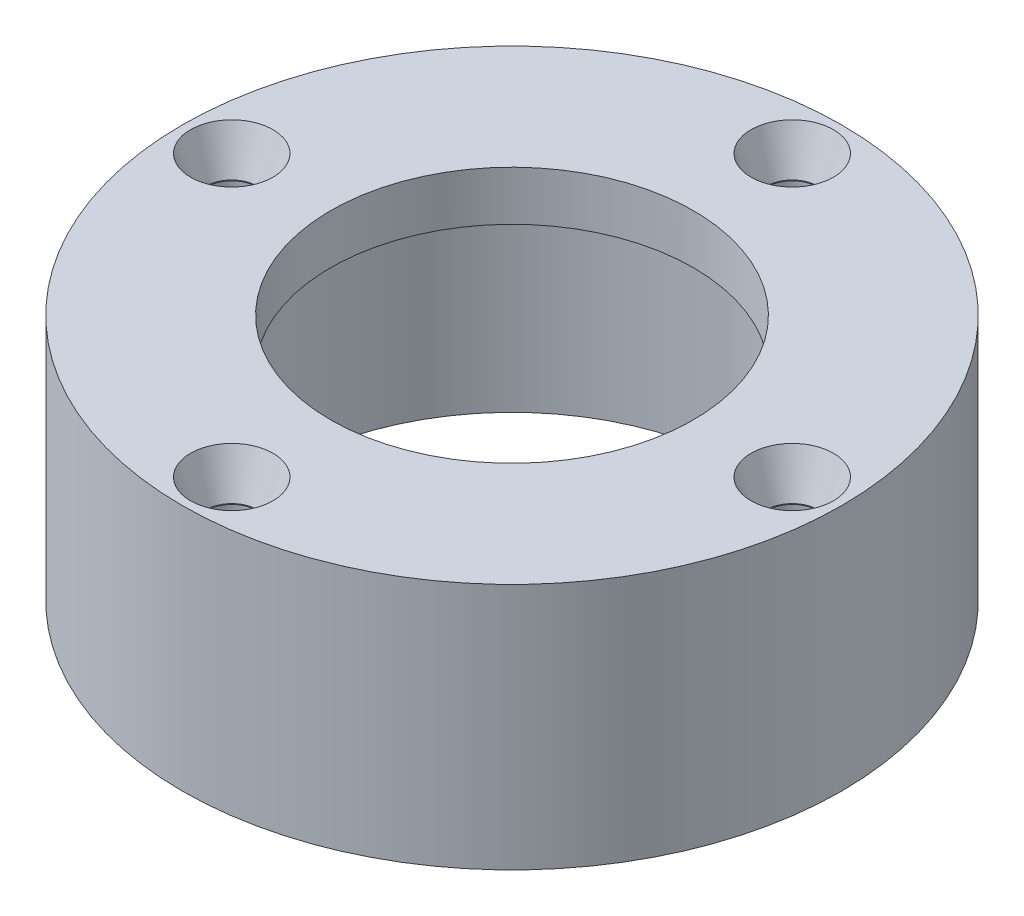
ISO-10303-21;
HEADER;
FILE_DESCRIPTION(('STEP AP214'),'2;1');
FILE_NAME('part.step','',(''),(''),'','','');
FILE_SCHEMA(('AUTOMOTIVE_DESIGN { 1 0 10303 214 1 1 1 1 }'));
ENDSEC;
DATA;
#1=APPLICATION_CONTEXT('core data for automotive mechanical design processes');
#2=APPLICATION_PROTOCOL_DEFINITION('international standard','automotive_design',2000,#1);
#3=PRODUCT_CONTEXT('',#1,'mechanical');
#4=PRODUCT('Part','Part','',(#3));
#5=PRODUCT_RELATED_PRODUCT_CATEGORY('part','',(#4));
#6=PRODUCT_DEFINITION_FORMATION('','',#4);
#7=PRODUCT_DEFINITION_CONTEXT('part definition',#1,'design');
#8=PRODUCT_DEFINITION('design','',#6,#7);
#9=PRODUCT_DEFINITION_SHAPE('','',#8);
#10=(LENGTH_UNIT() NAMED_UNIT(*) SI_UNIT(.MILLI.,.METRE.));
#11=(NAMED_UNIT(*) PLANE_ANGLE_UNIT() SI_UNIT($,.RADIAN.));
#12=(NAMED_UNIT(*) SI_UNIT($,.STERADIAN.) SOLID_ANGLE_UNIT());
#13=UNCERTAINTY_MEASURE_WITH_UNIT(LENGTH_MEASURE(1.E-05),#10,'distance_accuracy_value','');
#14=(GEOMETRIC_REPRESENTATION_CONTEXT(3) GLOBAL_UNCERTAINTY_ASSIGNED_CONTEXT((#13)) GLOBAL_UNIT_ASSIGNED_CONTEXT((#10,
#11,#12)) REPRESENTATION_CONTEXT('',''));
#15=CARTESIAN_POINT('',(0.,0.,0.));
#16=DIRECTION('',(0.,0.,1.));
#17=DIRECTION('',(1.,0.,0.));
#18=AXIS2_PLACEMENT_3D('',#15,#16,#17);
#19=CARTESIAN_POINT('',(-17.,20.,1.78065548281E-13));
#20=DIRECTION('',(0.,-1.,0.));
#21=DIRECTION('',(0.,0.,-1.));
#22=AXIS2_PLACEMENT_3D('',#19,#20,#21);
#23=CYLINDRICAL_SURFACE('',#22,1.5);
#24=CARTESIAN_POINT('',(-17.,0.,1.78065548281E-13));
#25=DIRECTION('',(0.,-1.,0.));
#26=DIRECTION('',(0.,0.,-1.));
#27=AXIS2_PLACEMENT_3D('',#24,#25,#26);
#28=CIRCLE('',#27,1.5);
#29=CARTESIAN_POINT('',(-17.,0.,-1.49999999999982));
#30=VERTEX_POINT('',#29);
#31=EDGE_CURVE('E52',#30,#30,#28,.T.);
#32=ORIENTED_EDGE('',*,*,#31,.T.);
#33=EDGE_LOOP('',(#32));
#34=FACE_BOUND('',#33,.T.);
#35=CARTESIAN_POINT('',(-17.,12.5,1.78065548281E-13));
#36=DIRECTION('',(0.,1.,0.));
#37=DIRECTION('',(0.,0.,1.));
#38=AXIS2_PLACEMENT_3D('',#35,#36,#37);
#39=CIRCLE('',#38,1.5);
#40=CARTESIAN_POINT('',(-17.,12.5,1.50000000000018));
#41=VERTEX_POINT('',#40);
#42=EDGE_CURVE('E63',#41,#41,#39,.F.);
#43=ORIENTED_EDGE('',*,*,#42,.F.);
#44=EDGE_LOOP('',(#43));
#45=FACE_BOUND('',#44,.T.);
#46=ADVANCED_FACE('F31',(#34,#45),#23,.F.);
#47=CARTESIAN_POINT('',(0.,20.,17.));
#48=DIRECTION('',(0.,-1.,0.));
#49=DIRECTION('',(0.,0.,-1.));
#50=AXIS2_PLACEMENT_3D('',#47,#48,#49);
#51=CYLINDRICAL_SURFACE('',#50,1.5);
#52=CARTESIAN_POINT('',(0.,0.,17.));
#53=DIRECTION('',(0.,-1.,0.));
#54=DIRECTION('',(0.,0.,-1.));
#55=AXIS2_PLACEMENT_3D('',#52,#53,#54);
#56=CIRCLE('',#55,1.5);
#57=CARTESIAN_POINT('',(0.,0.,15.5));
#58=VERTEX_POINT('',#57);
#59=EDGE_CURVE('E44',#58,#58,#56,.T.);
#60=ORIENTED_EDGE('',*,*,#59,.T.);
#61=EDGE_LOOP('',(#60));
#62=FACE_BOUND('',#61,.T.);
#63=CARTESIAN_POINT('',(0.,12.5,17.));
#64=DIRECTION('',(0.,1.,0.));
#65=DIRECTION('',(0.,0.,1.));
#66=AXIS2_PLACEMENT_3D('',#63,#64,#65);
#67=CIRCLE('',#66,1.5);
#68=CARTESIAN_POINT('',(0.,12.5,18.5));
#69=VERTEX_POINT('',#68);
#70=EDGE_CURVE('E59',#69,#69,#67,.F.);
#71=ORIENTED_EDGE('',*,*,#70,.F.);
#72=EDGE_LOOP('',(#71));
#73=FACE_BOUND('',#72,.T.);
#74=ADVANCED_FACE('F102',(#62,#73),#51,.F.);
#75=CARTESIAN_POINT('',(17.,20.,0.));
#76=DIRECTION('',(0.,-1.,0.));
#77=DIRECTION('',(0.,0.,-1.));
#78=AXIS2_PLACEMENT_3D('',#75,#76,#77);
#79=CYLINDRICAL_SURFACE('',#78,1.5);
#80=CARTESIAN_POINT('',(17.,0.,0.));
#81=DIRECTION('',(0.,-1.,0.));
#82=DIRECTION('',(0.,0.,-1.));
#83=AXIS2_PLACEMENT_3D('',#80,#81,#82);
#84=CIRCLE('',#83,1.5);
#85=CARTESIAN_POINT('',(17.,0.,-1.50000000000006));
#86=VERTEX_POINT('',#85);
#87=EDGE_CURVE('E95',#86,#86,#84,.T.);
#88=ORIENTED_EDGE('',*,*,#87,.T.);
#89=EDGE_LOOP('',(#88));
#90=FACE_BOUND('',#89,.T.);
#91=CARTESIAN_POINT('',(17.,12.5,0.));
#92=DIRECTION('',(0.,1.,0.));
#93=DIRECTION('',(0.,0.,1.));
#94=AXIS2_PLACEMENT_3D('',#91,#92,#93);
#95=CIRCLE('',#94,1.5);
#96=CARTESIAN_POINT('',(17.,12.5,1.49999999999994));
#97=VERTEX_POINT('',#96);
#98=EDGE_CURVE('E54',#97,#97,#95,.F.);
#99=ORIENTED_EDGE('',*,*,#98,.F.);
#100=EDGE_LOOP('',(#99));
#101=FACE_BOUND('',#100,.T.);
#102=ADVANCED_FACE('F123',(#90,#101),#79,.F.);
#103=CARTESIAN_POINT('',(-1.18710365520667E-13,20.,-17.));
#104=DIRECTION('',(0.,-1.,0.));
#105=DIRECTION('',(0.,0.,-1.));
#106=AXIS2_PLACEMENT_3D('',#103,#104,#105);
#107=CYLINDRICAL_SURFACE('',#106,1.5);
#108=CARTESIAN_POINT('',(-1.18710365520667E-13,0.,-17.));
#109=DIRECTION('',(0.,-1.,0.));
#110=DIRECTION('',(0.,0.,-1.));
#111=AXIS2_PLACEMENT_3D('',#108,#109,#110);
#112=CIRCLE('',#111,1.5);
#113=CARTESIAN_POINT('',(-1.18710365520667E-13,0.,-18.5));
#114=VERTEX_POINT('',#113);
#115=EDGE_CURVE('E93',#114,#114,#112,.T.);
#116=ORIENTED_EDGE('',*,*,#115,.T.);
#117=EDGE_LOOP('',(#116));
#118=FACE_BOUND('',#117,.T.);
#119=CARTESIAN_POINT('',(-1.18710365520667E-13,12.5,-17.));
#120=DIRECTION('',(0.,1.,0.));
#121=DIRECTION('',(0.,0.,1.));
#122=AXIS2_PLACEMENT_3D('',#119,#120,#121);
#123=CIRCLE('',#122,1.5);
#124=CARTESIAN_POINT('',(-1.18710365520667E-13,12.5,-15.5));
#125=VERTEX_POINT('',#124);
#126=EDGE_CURVE('E49',#125,#125,#123,.F.);
#127=ORIENTED_EDGE('',*,*,#126,.F.);
#128=EDGE_LOOP('',(#127));
#129=FACE_BOUND('',#128,.T.);
#130=ADVANCED_FACE('F114',(#118,#129),#107,.F.);
#131=CARTESIAN_POINT('',(0.,15.,0.));
#132=DIRECTION('',(0.,-1.,0.));
#133=DIRECTION('',(0.,0.,-1.));
#134=AXIS2_PLACEMENT_3D('',#131,#132,#133);
#135=CYLINDRICAL_SURFACE('',#134,20.);
#136=CARTESIAN_POINT('',(0.,15.,0.));
#137=DIRECTION('',(0.,1.,0.));
#138=DIRECTION('',(0.,0.,1.));
#139=AXIS2_PLACEMENT_3D('',#136,#137,#138);
#140=CIRCLE('',#139,20.);
#141=CARTESIAN_POINT('',(0.,15.,20.));
#142=VERTEX_POINT('',#141);
#143=EDGE_CURVE('E10',#142,#142,#140,.T.);
#144=ORIENTED_EDGE('',*,*,#143,.F.);
#145=EDGE_LOOP('',(#144));
#146=FACE_BOUND('',#145,.T.);
#147=CARTESIAN_POINT('',(0.,0.,0.));
#148=DIRECTION('',(0.,1.,0.));
#149=DIRECTION('',(0.,0.,1.));
#150=AXIS2_PLACEMENT_3D('',#147,#148,#149);
#151=CIRCLE('',#150,20.);
#152=CARTESIAN_POINT('',(0.,0.,20.));
#153=VERTEX_POINT('',#152);
#154=EDGE_CURVE('E39',#153,#153,#151,.T.);
#155=ORIENTED_EDGE('',*,*,#154,.T.);
#156=EDGE_LOOP('',(#155));
#157=FACE_BOUND('',#156,.T.);
#158=ADVANCED_FACE('F33',(#146,#157),#135,.T.);
#159=CARTESIAN_POINT('',(0.,15.,0.));
#160=DIRECTION('',(0.,1.,0.));
#161=DIRECTION('',(0.,0.,1.));
#162=AXIS2_PLACEMENT_3D('',#159,#160,#161);
#163=PLANE('',#162);
#164=CARTESIAN_POINT('',(0.,15.,0.));
#165=DIRECTION('',(0.,1.,0.));
#166=DIRECTION('',(0.,0.,1.));
#167=AXIS2_PLACEMENT_3D('',#164,#165,#166);
#168=CIRCLE('',#167,11.);
#169=CARTESIAN_POINT('',(0.,15.,11.));
#170=VERTEX_POINT('',#169);
#171=EDGE_CURVE('E267',#170,#170,#168,.T.);
#172=ORIENTED_EDGE('',*,*,#171,.F.);
#173=EDGE_LOOP('',(#172));
#174=FACE_BOUND('',#173,.T.);
#175=CARTESIAN_POINT('',(-16.9999999999995,15.,6.03961325396085E-13));
#176=DIRECTION('',(0.,1.,0.));
#177=DIRECTION('',(0.,0.,1.));
#178=AXIS2_PLACEMENT_3D('',#175,#176,#177);
#179=CIRCLE('',#178,2.50000000000078);
#180=CARTESIAN_POINT('',(-16.9999999999995,15.,2.50000000000138));
#181=VERTEX_POINT('',#180);
#182=EDGE_CURVE('E72',#181,#181,#179,.T.);
#183=ORIENTED_EDGE('',*,*,#182,.F.);
#184=EDGE_LOOP('',(#183));
#185=FACE_BOUND('',#184,.T.);
#186=CARTESIAN_POINT('',(1.0850484861544E-12,15.,17.));
#187=DIRECTION('',(0.,1.,0.));
#188=DIRECTION('',(0.,0.,1.));
#189=AXIS2_PLACEMENT_3D('',#186,#187,#188);
#190=CIRCLE('',#189,2.50000000000104);
#191=CARTESIAN_POINT('',(1.0850484861544E-12,15.,19.500000000001));
#192=VERTEX_POINT('',#191);
#193=EDGE_CURVE('E65',#192,#192,#190,.T.);
#194=ORIENTED_EDGE('',*,*,#193,.F.);
#195=EDGE_LOOP('',(#194));
#196=FACE_BOUND('',#195,.T.);
#197=CARTESIAN_POINT('',(17.0000000000005,15.,-6.01879425837535E-13));
#198=DIRECTION('',(0.,1.,0.));
#199=DIRECTION('',(0.,0.,1.));
#200=AXIS2_PLACEMENT_3D('',#197,#198,#199);
#201=CIRCLE('',#200,2.50000000000038);
#202=CARTESIAN_POINT('',(17.0000000000005,15.,2.49999999999978));
#203=VERTEX_POINT('',#202);
#204=EDGE_CURVE('E61',#203,#203,#201,.T.);
#205=ORIENTED_EDGE('',*,*,#204,.F.);
#206=EDGE_LOOP('',(#205));
#207=FACE_BOUND('',#206,.T.);
#208=CARTESIAN_POINT('',(-1.18710365520667E-13,15.,-17.));
#209=DIRECTION('',(0.,1.,0.));
#210=DIRECTION('',(0.,0.,1.));
#211=AXIS2_PLACEMENT_3D('',#208,#209,#210);
#212=CIRCLE('',#211,2.5);
#213=CARTESIAN_POINT('',(-1.18710365520667E-13,15.,-14.5));
#214=VERTEX_POINT('',#213);
#215=EDGE_CURVE('E57',#214,#214,#212,.T.);
#216=ORIENTED_EDGE('',*,*,#215,.F.);
#217=EDGE_LOOP('',(#216));
#218=FACE_BOUND('',#217,.T.);
#219=ORIENTED_EDGE('',*,*,#143,.T.);
#220=EDGE_LOOP('',(#219));
#221=FACE_BOUND('',#220,.T.);
#222=ADVANCED_FACE('F109',(#174,#185,#196,#207,#218,#221),#163,.T.);
#223=CARTESIAN_POINT('',(0.,0.,0.));
#224=DIRECTION('',(0.,1.,0.));
#225=DIRECTION('',(0.,0.,1.));
#226=AXIS2_PLACEMENT_3D('',#223,#224,#225);
#227=PLANE('',#226);
#228=CARTESIAN_POINT('',(0.,0.,0.));
#229=DIRECTION('',(0.,-1.,0.));
#230=DIRECTION('',(0.,0.,-1.));
#231=AXIS2_PLACEMENT_3D('',#228,#229,#230);
#232=CIRCLE('',#231,14.);
#233=CARTESIAN_POINT('',(0.,0.,-14.));
#234=VERTEX_POINT('',#233);
#235=EDGE_CURVE('E269',#234,#234,#232,.T.);
#236=ORIENTED_EDGE('',*,*,#235,.F.);
#237=EDGE_LOOP('',(#236));
#238=FACE_BOUND('',#237,.T.);
#239=ORIENTED_EDGE('',*,*,#31,.F.);
#240=EDGE_LOOP('',(#239));
#241=FACE_BOUND('',#240,.T.);
#242=ORIENTED_EDGE('',*,*,#115,.F.);
#243=EDGE_LOOP('',(#242));
#244=FACE_BOUND('',#243,.T.);
#245=ORIENTED_EDGE('',*,*,#87,.F.);
#246=EDGE_LOOP('',(#245));
#247=FACE_BOUND('',#246,.T.);
#248=ORIENTED_EDGE('',*,*,#59,.F.);
#249=EDGE_LOOP('',(#248));
#250=FACE_BOUND('',#249,.T.);
#251=ORIENTED_EDGE('',*,*,#154,.F.);
#252=EDGE_LOOP('',(#251));
#253=FACE_BOUND('',#252,.T.);
#254=ADVANCED_FACE('F105',(#238,#241,#244,#247,#250,#253),#227,.F.);
#255=CARTESIAN_POINT('',(-1.18710365520667E-13,12.5,-17.));
#256=DIRECTION('',(0.,1.,0.));
#257=DIRECTION('',(0.,0.,1.));
#258=AXIS2_PLACEMENT_3D('',#255,#256,#257);
#259=PLANE('',#258);
#260=CARTESIAN_POINT('',(-1.18710365520667E-13,12.5,-17.));
#261=DIRECTION('',(0.,1.,0.));
#262=DIRECTION('',(0.,0.,1.));
#263=AXIS2_PLACEMENT_3D('',#260,#261,#262);
#264=CIRCLE('',#263,1.56528830128799);
#265=CARTESIAN_POINT('',(-1.18710365520667E-13,12.5,-15.434711698712));
#266=VERTEX_POINT('',#265);
#267=EDGE_CURVE('E53',#266,#266,#264,.T.);
#268=ORIENTED_EDGE('',*,*,#267,.T.);
#269=EDGE_LOOP('',(#268));
#270=FACE_BOUND('',#269,.T.);
#271=ORIENTED_EDGE('',*,*,#126,.T.);
#272=EDGE_LOOP('',(#271));
#273=FACE_BOUND('',#272,.T.);
#274=ADVANCED_FACE('F108',(#270,#273),#259,.T.);
#275=CARTESIAN_POINT('',(-1.18710365520667E-13,15.,-17.));
#276=DIRECTION('',(0.,1.,0.));
#277=DIRECTION('',(0.,0.,1.));
#278=AXIS2_PLACEMENT_3D('',#275,#276,#277);
#279=CONICAL_SURFACE('',#278,2.5,0.357792496658838);
#280=ORIENTED_EDGE('',*,*,#267,.F.);
#281=EDGE_LOOP('',(#280));
#282=FACE_BOUND('',#281,.T.);
#283=ORIENTED_EDGE('',*,*,#215,.T.);
#284=EDGE_LOOP('',(#283));
#285=FACE_BOUND('',#284,.T.);
#286=ADVANCED_FACE('F135',(#282,#285),#279,.F.);
#287=CARTESIAN_POINT('',(17.0000000000005,12.5,-6.01879425837535E-13));
#288=DIRECTION('',(0.,1.,0.));
#289=DIRECTION('',(0.,0.,1.));
#290=AXIS2_PLACEMENT_3D('',#287,#288,#289);
#291=PLANE('',#290);
#292=CARTESIAN_POINT('',(17.0000000000005,12.5,-6.01879425837535E-13));
#293=DIRECTION('',(0.,1.,0.));
#294=DIRECTION('',(0.,0.,1.));
#295=AXIS2_PLACEMENT_3D('',#292,#293,#294);
#296=CIRCLE('',#295,1.56528830128836);
#297=CARTESIAN_POINT('',(17.0000000000005,12.5,1.56528830128776));
#298=VERTEX_POINT('',#297);
#299=EDGE_CURVE('E58',#298,#298,#296,.T.);
#300=ORIENTED_EDGE('',*,*,#299,.T.);
#301=EDGE_LOOP('',(#300));
#302=FACE_BOUND('',#301,.T.);
#303=ORIENTED_EDGE('',*,*,#98,.T.);
#304=EDGE_LOOP('',(#303));
#305=FACE_BOUND('',#304,.T.);
#306=ADVANCED_FACE('F144',(#302,#305),#291,.T.);
#307=CARTESIAN_POINT('',(17.0000000000005,15.,-6.01879425837535E-13));
#308=DIRECTION('',(0.,1.,0.));
#309=DIRECTION('',(0.,0.,1.));
#310=AXIS2_PLACEMENT_3D('',#307,#308,#309);
#311=CONICAL_SURFACE('',#310,2.50000000000038,0.357792496658838);
#312=ORIENTED_EDGE('',*,*,#299,.F.);
#313=EDGE_LOOP('',(#312));
#314=FACE_BOUND('',#313,.T.);
#315=ORIENTED_EDGE('',*,*,#204,.T.);
#316=EDGE_LOOP('',(#315));
#317=FACE_BOUND('',#316,.T.);
#318=ADVANCED_FACE('F146',(#314,#317),#311,.F.);
#319=CARTESIAN_POINT('',(1.0850484861544E-12,12.5,17.));
#320=DIRECTION('',(0.,1.,0.));
#321=DIRECTION('',(0.,0.,1.));
#322=AXIS2_PLACEMENT_3D('',#319,#320,#321);
#323=PLANE('',#322);
#324=CARTESIAN_POINT('',(1.0850484861544E-12,12.5,17.));
#325=DIRECTION('',(0.,1.,0.));
#326=DIRECTION('',(0.,0.,1.));
#327=AXIS2_PLACEMENT_3D('',#324,#325,#326);
#328=CIRCLE('',#327,1.56528830128902);
#329=CARTESIAN_POINT('',(1.0850484861544E-12,12.5,18.565288301289));
#330=VERTEX_POINT('',#329);
#331=EDGE_CURVE('E62',#330,#330,#328,.T.);
#332=ORIENTED_EDGE('',*,*,#331,.T.);
#333=EDGE_LOOP('',(#332));
#334=FACE_BOUND('',#333,.T.);
#335=ORIENTED_EDGE('',*,*,#70,.T.);
#336=EDGE_LOOP('',(#335));
#337=FACE_BOUND('',#336,.T.);
#338=ADVANCED_FACE('F153',(#334,#337),#323,.T.);
#339=CARTESIAN_POINT('',(1.0850484861544E-12,15.,17.));
#340=DIRECTION('',(0.,1.,0.));
#341=DIRECTION('',(0.,0.,1.));
#342=AXIS2_PLACEMENT_3D('',#339,#340,#341);
#343=CONICAL_SURFACE('',#342,2.50000000000104,0.357792496658838);
#344=ORIENTED_EDGE('',*,*,#331,.F.);
#345=EDGE_LOOP('',(#344));
#346=FACE_BOUND('',#345,.T.);
#347=ORIENTED_EDGE('',*,*,#193,.T.);
#348=EDGE_LOOP('',(#347));
#349=FACE_BOUND('',#348,.T.);
#350=ADVANCED_FACE('F158',(#346,#349),#343,.F.);
#351=CARTESIAN_POINT('',(-16.9999999999995,12.5,6.03961325396085E-13));
#352=DIRECTION('',(0.,1.,0.));
#353=DIRECTION('',(0.,0.,1.));
#354=AXIS2_PLACEMENT_3D('',#351,#352,#353);
#355=PLANE('',#354);
#356=CARTESIAN_POINT('',(-16.9999999999995,12.5,6.03961325396085E-13));
#357=DIRECTION('',(0.,1.,0.));
#358=DIRECTION('',(0.,0.,1.));
#359=AXIS2_PLACEMENT_3D('',#356,#357,#358);
#360=CIRCLE('',#359,1.56528830128876);
#361=CARTESIAN_POINT('',(-16.9999999999995,12.5,1.56528830128937));
#362=VERTEX_POINT('',#361);
#363=EDGE_CURVE('E66',#362,#362,#360,.T.);
#364=ORIENTED_EDGE('',*,*,#363,.T.);
#365=EDGE_LOOP('',(#364));
#366=FACE_BOUND('',#365,.T.);
#367=ORIENTED_EDGE('',*,*,#42,.T.);
#368=EDGE_LOOP('',(#367));
#369=FACE_BOUND('',#368,.T.);
#370=ADVANCED_FACE('F206',(#366,#369),#355,.T.);
#371=CARTESIAN_POINT('',(-16.9999999999995,15.,6.03961325396085E-13));
#372=DIRECTION('',(0.,1.,0.));
#373=DIRECTION('',(0.,0.,1.));
#374=AXIS2_PLACEMENT_3D('',#371,#372,#373);
#375=CONICAL_SURFACE('',#374,2.50000000000078,0.357792496658838);
#376=ORIENTED_EDGE('',*,*,#363,.F.);
#377=EDGE_LOOP('',(#376));
#378=FACE_BOUND('',#377,.T.);
#379=ORIENTED_EDGE('',*,*,#182,.T.);
#380=EDGE_LOOP('',(#379));
#381=FACE_BOUND('',#380,.T.);
#382=ADVANCED_FACE('F215',(#378,#381),#375,.F.);
#383=CARTESIAN_POINT('',(0.,12.,0.));
#384=DIRECTION('',(0.,-1.,0.));
#385=DIRECTION('',(0.,0.,-1.));
#386=AXIS2_PLACEMENT_3D('',#383,#384,#385);
#387=CYLINDRICAL_SURFACE('',#386,14.);
#388=CARTESIAN_POINT('',(0.,12.,0.));
#389=DIRECTION('',(0.,-1.,0.));
#390=DIRECTION('',(0.,0.,-1.));
#391=AXIS2_PLACEMENT_3D('',#388,#389,#390);
#392=CIRCLE('',#391,14.);
#393=CARTESIAN_POINT('',(0.,12.,-14.));
#394=VERTEX_POINT('',#393);
#395=EDGE_CURVE('E77',#394,#394,#392,.T.);
#396=ORIENTED_EDGE('',*,*,#395,.F.);
#397=EDGE_LOOP('',(#396));
#398=FACE_BOUND('',#397,.T.);
#399=ORIENTED_EDGE('',*,*,#235,.T.);
#400=EDGE_LOOP('',(#399));
#401=FACE_BOUND('',#400,.T.);
#402=ADVANCED_FACE('F223',(#398,#401),#387,.F.);
#403=CARTESIAN_POINT('',(0.,12.,0.));
#404=DIRECTION('',(0.,-1.,0.));
#405=DIRECTION('',(0.,0.,-1.));
#406=AXIS2_PLACEMENT_3D('',#403,#404,#405);
#407=PLANE('',#406);
#408=CARTESIAN_POINT('',(0.,12.,0.));
#409=DIRECTION('',(0.,-1.,0.));
#410=DIRECTION('',(0.,0.,-1.));
#411=AXIS2_PLACEMENT_3D('',#408,#409,#410);
#412=CIRCLE('',#411,11.);
#413=CARTESIAN_POINT('',(0.,12.,-11.));
#414=VERTEX_POINT('',#413);
#415=EDGE_CURVE('E35',#414,#414,#412,.T.);
#416=ORIENTED_EDGE('',*,*,#415,.F.);
#417=EDGE_LOOP('',(#416));
#418=FACE_BOUND('',#417,.T.);
#419=ORIENTED_EDGE('',*,*,#395,.T.);
#420=EDGE_LOOP('',(#419));
#421=FACE_BOUND('',#420,.T.);
#422=ADVANCED_FACE('F234',(#418,#421),#407,.T.);
#423=CARTESIAN_POINT('',(0.,3.,0.));
#424=DIRECTION('',(0.,1.,0.));
#425=DIRECTION('',(0.,0.,1.));
#426=AXIS2_PLACEMENT_3D('',#423,#424,#425);
#427=CYLINDRICAL_SURFACE('',#426,11.);
#428=ORIENTED_EDGE('',*,*,#415,.T.);
#429=EDGE_LOOP('',(#428));
#430=FACE_BOUND('',#429,.T.);
#431=ORIENTED_EDGE('',*,*,#171,.T.);
#432=EDGE_LOOP('',(#431));
#433=FACE_BOUND('',#432,.T.);
#434=ADVANCED_FACE('F248',(#430,#433),#427,.F.);
#435=CLOSED_SHELL('',(#46,#74,#102,#130,#158,#222,#254,#274,#286,#306,#318,#338,#350,#370,#382,
#402,#422,#434));
#436=MANIFOLD_SOLID_BREP('B2',#435);
#437=ADVANCED_BREP_SHAPE_REPRESENTATION('',(#18,#436),#14);
#438=SHAPE_DEFINITION_REPRESENTATION(#9,#437);
ENDSEC;
END-ISO-10303-21;
